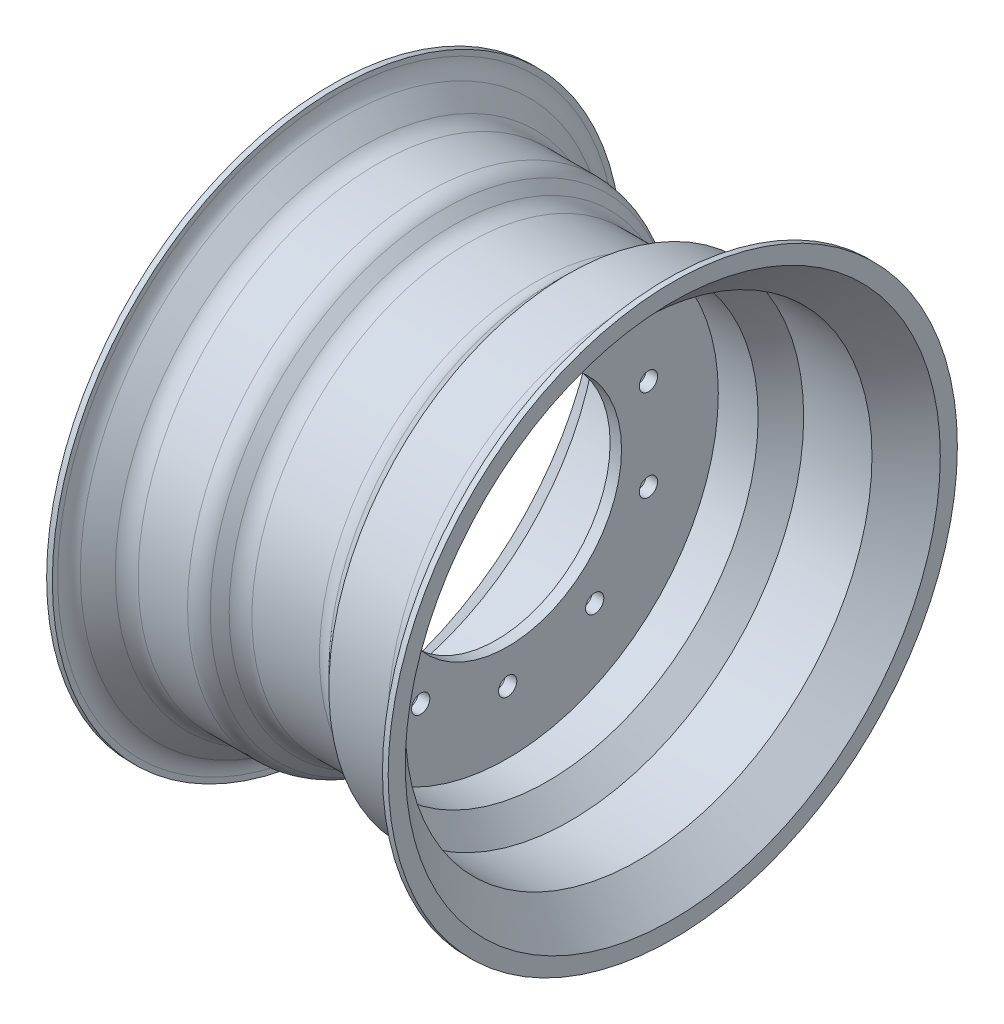
ISO-10303-21;
HEADER;
FILE_DESCRIPTION(('STEP AP214'),'2;1');
FILE_NAME('part.step','',(''),(''),'','','');
FILE_SCHEMA(('AUTOMOTIVE_DESIGN { 1 0 10303 214 1 1 1 1 }'));
ENDSEC;
DATA;
#1=APPLICATION_CONTEXT('core data for automotive mechanical design processes');
#2=APPLICATION_PROTOCOL_DEFINITION('international standard','automotive_design',2000,#1);
#3=PRODUCT_CONTEXT('',#1,'mechanical');
#4=PRODUCT('Part','Part','',(#3));
#5=PRODUCT_RELATED_PRODUCT_CATEGORY('part','',(#4));
#6=PRODUCT_DEFINITION_FORMATION('','',#4);
#7=PRODUCT_DEFINITION_CONTEXT('part definition',#1,'design');
#8=PRODUCT_DEFINITION('design','',#6,#7);
#9=PRODUCT_DEFINITION_SHAPE('','',#8);
#10=(LENGTH_UNIT() NAMED_UNIT(*) SI_UNIT(.MILLI.,.METRE.));
#11=(NAMED_UNIT(*) PLANE_ANGLE_UNIT() SI_UNIT($,.RADIAN.));
#12=(NAMED_UNIT(*) SI_UNIT($,.STERADIAN.) SOLID_ANGLE_UNIT());
#13=UNCERTAINTY_MEASURE_WITH_UNIT(LENGTH_MEASURE(1.E-05),#10,'distance_accuracy_value','');
#14=(GEOMETRIC_REPRESENTATION_CONTEXT(3) GLOBAL_UNCERTAINTY_ASSIGNED_CONTEXT((#13)) GLOBAL_UNIT_ASSIGNED_CONTEXT((#10,
#11,#12)) REPRESENTATION_CONTEXT('',''));
#15=CARTESIAN_POINT('',(0.,0.,0.));
#16=DIRECTION('',(0.,0.,1.));
#17=DIRECTION('',(1.,0.,0.));
#18=AXIS2_PLACEMENT_3D('',#15,#16,#17);
#19=CARTESIAN_POINT('',(0.,0.,0.));
#20=DIRECTION('',(1.,0.,0.));
#21=DIRECTION('',(0.,0.,-1.));
#22=AXIS2_PLACEMENT_3D('',#19,#20,#21);
#23=CYLINDRICAL_SURFACE('',#22,250.);
#24=CARTESIAN_POINT('',(-150.,0.,0.));
#25=DIRECTION('',(1.,0.,0.));
#26=DIRECTION('',(0.,0.,-1.));
#27=AXIS2_PLACEMENT_3D('',#24,#25,#26);
#28=CIRCLE('',#27,250.);
#29=CARTESIAN_POINT('',(-150.,0.,-250.));
#30=VERTEX_POINT('',#29);
#31=EDGE_CURVE('E60',#30,#30,#28,.T.);
#32=ORIENTED_EDGE('',*,*,#31,.T.);
#33=EDGE_LOOP('',(#32));
#34=FACE_BOUND('',#33,.T.);
#35=CARTESIAN_POINT('',(-145.,0.,0.));
#36=DIRECTION('',(1.,0.,0.));
#37=DIRECTION('',(0.,0.,-1.));
#38=AXIS2_PLACEMENT_3D('',#35,#36,#37);
#39=CIRCLE('',#38,250.);
#40=CARTESIAN_POINT('',(-145.,0.,-250.));
#41=VERTEX_POINT('',#40);
#42=EDGE_CURVE('E170',#41,#41,#39,.T.);
#43=ORIENTED_EDGE('',*,*,#42,.F.);
#44=EDGE_LOOP('',(#43));
#45=FACE_BOUND('',#44,.T.);
#46=ADVANCED_FACE('F37',(#34,#45),#23,.T.);
#47=CARTESIAN_POINT('',(-145.,250.,0.));
#48=DIRECTION('',(1.,0.,0.));
#49=DIRECTION('',(0.,0.,-1.));
#50=AXIS2_PLACEMENT_3D('',#47,#48,#49);
#51=PLANE('',#50);
#52=CARTESIAN_POINT('',(-145.,0.,0.));
#53=DIRECTION('',(1.,0.,0.));
#54=DIRECTION('',(0.,0.,-1.));
#55=AXIS2_PLACEMENT_3D('',#52,#53,#54);
#56=CIRCLE('',#55,245.355339059327);
#57=CARTESIAN_POINT('',(-145.,0.,-245.355339059327));
#58=VERTEX_POINT('',#57);
#59=EDGE_CURVE('E10',#58,#58,#56,.F.);
#60=ORIENTED_EDGE('',*,*,#59,.T.);
#61=EDGE_LOOP('',(#60));
#62=FACE_BOUND('',#61,.T.);
#63=ORIENTED_EDGE('',*,*,#42,.T.);
#64=EDGE_LOOP('',(#63));
#65=FACE_BOUND('',#64,.T.);
#66=ADVANCED_FACE('F237',(#62,#65),#51,.T.);
#67=CARTESIAN_POINT('',(-117.928932188135,0.,0.));
#68=DIRECTION('',(-1.,0.,0.));
#69=DIRECTION('',(0.,0.,1.));
#70=AXIS2_PLACEMENT_3D('',#67,#68,#69);
#71=CONICAL_SURFACE('',#70,210.,0.785398163397448);
#72=CARTESIAN_POINT('',(-123.786796564404,0.,0.));
#73=DIRECTION('',(-1.,0.,0.));
#74=DIRECTION('',(0.,0.,1.));
#75=AXIS2_PLACEMENT_3D('',#72,#73,#74);
#76=CIRCLE('',#75,215.857864376269);
#77=CARTESIAN_POINT('',(-123.786796564404,0.,215.857864376269));
#78=VERTEX_POINT('',#77);
#79=EDGE_CURVE('E46',#78,#78,#76,.T.);
#80=ORIENTED_EDGE('',*,*,#79,.T.);
#81=EDGE_LOOP('',(#80));
#82=FACE_BOUND('',#81,.T.);
#83=CARTESIAN_POINT('',(-139.142135623731,0.,0.));
#84=DIRECTION('',(-1.,0.,0.));
#85=DIRECTION('',(0.,0.,1.));
#86=AXIS2_PLACEMENT_3D('',#83,#84,#85);
#87=CIRCLE('',#86,231.213203435596);
#88=CARTESIAN_POINT('',(-139.142135623731,0.,231.213203435596));
#89=VERTEX_POINT('',#88);
#90=EDGE_CURVE('E52',#89,#89,#87,.F.);
#91=ORIENTED_EDGE('',*,*,#90,.T.);
#92=EDGE_LOOP('',(#91));
#93=FACE_BOUND('',#92,.T.);
#94=ADVANCED_FACE('F221',(#82,#93),#71,.T.);
#95=CARTESIAN_POINT('',(0.,0.,0.));
#96=DIRECTION('',(1.,0.,0.));
#97=DIRECTION('',(0.,0.,-1.));
#98=AXIS2_PLACEMENT_3D('',#95,#96,#97);
#99=CYLINDRICAL_SURFACE('',#98,210.);
#100=CARTESIAN_POINT('',(-66.2132034355965,0.,0.));
#101=DIRECTION('',(-1.,0.,0.));
#102=DIRECTION('',(0.,0.,1.));
#103=AXIS2_PLACEMENT_3D('',#100,#101,#102);
#104=CIRCLE('',#103,210.);
#105=CARTESIAN_POINT('',(-66.2132034355965,0.,210.));
#106=VERTEX_POINT('',#105);
#107=EDGE_CURVE('E214',#106,#106,#104,.T.);
#108=ORIENTED_EDGE('',*,*,#107,.T.);
#109=EDGE_LOOP('',(#108));
#110=FACE_BOUND('',#109,.T.);
#111=CARTESIAN_POINT('',(-109.644660940673,0.,0.));
#112=DIRECTION('',(1.,0.,0.));
#113=DIRECTION('',(0.,0.,-1.));
#114=AXIS2_PLACEMENT_3D('',#111,#112,#113);
#115=CIRCLE('',#114,210.);
#116=CARTESIAN_POINT('',(-109.644660940673,0.,-210.));
#117=VERTEX_POINT('',#116);
#118=EDGE_CURVE('E210',#117,#117,#115,.T.);
#119=ORIENTED_EDGE('',*,*,#118,.T.);
#120=EDGE_LOOP('',(#119));
#121=FACE_BOUND('',#120,.T.);
#122=ADVANCED_FACE('F275',(#110,#121),#99,.T.);
#123=CARTESIAN_POINT('',(-37.9289321881344,0.,0.));
#124=DIRECTION('',(-1.,0.,0.));
#125=DIRECTION('',(0.,0.,1.));
#126=AXIS2_PLACEMENT_3D('',#123,#124,#125);
#127=CONICAL_SURFACE('',#126,190.,0.785398163397448);
#128=CARTESIAN_POINT('',(-43.7867965644035,0.,0.));
#129=DIRECTION('',(-1.,0.,0.));
#130=DIRECTION('',(0.,0.,1.));
#131=AXIS2_PLACEMENT_3D('',#128,#129,#130);
#132=CIRCLE('',#131,195.857864376269);
#133=CARTESIAN_POINT('',(-43.7867965644035,0.,195.857864376269));
#134=VERTEX_POINT('',#133);
#135=EDGE_CURVE('E206',#134,#134,#132,.T.);
#136=ORIENTED_EDGE('',*,*,#135,.T.);
#137=EDGE_LOOP('',(#136));
#138=FACE_BOUND('',#137,.T.);
#139=CARTESIAN_POINT('',(-52.0710678118655,0.,0.));
#140=DIRECTION('',(1.,0.,0.));
#141=DIRECTION('',(0.,0.,-1.));
#142=AXIS2_PLACEMENT_3D('',#139,#140,#141);
#143=CIRCLE('',#142,204.142135623731);
#144=CARTESIAN_POINT('',(-52.0710678118655,0.,-204.142135623731));
#145=VERTEX_POINT('',#144);
#146=EDGE_CURVE('E202',#145,#145,#143,.T.);
#147=ORIENTED_EDGE('',*,*,#146,.T.);
#148=EDGE_LOOP('',(#147));
#149=FACE_BOUND('',#148,.T.);
#150=ADVANCED_FACE('F272',(#138,#149),#127,.T.);
#151=CARTESIAN_POINT('',(0.,0.,0.));
#152=DIRECTION('',(1.,0.,0.));
#153=DIRECTION('',(0.,0.,-1.));
#154=AXIS2_PLACEMENT_3D('',#151,#152,#153);
#155=CYLINDRICAL_SURFACE('',#154,190.);
#156=CARTESIAN_POINT('',(29.6446609406725,0.,0.));
#157=DIRECTION('',(1.,0.,0.));
#158=DIRECTION('',(0.,0.,-1.));
#159=AXIS2_PLACEMENT_3D('',#156,#157,#158);
#160=CIRCLE('',#159,190.);
#161=CARTESIAN_POINT('',(29.6446609406725,0.,-190.));
#162=VERTEX_POINT('',#161);
#163=EDGE_CURVE('E182',#162,#162,#160,.F.);
#164=ORIENTED_EDGE('',*,*,#163,.T.);
#165=EDGE_LOOP('',(#164));
#166=FACE_BOUND('',#165,.T.);
#167=CARTESIAN_POINT('',(-29.6446609406725,0.,0.));
#168=DIRECTION('',(1.,0.,0.));
#169=DIRECTION('',(0.,0.,-1.));
#170=AXIS2_PLACEMENT_3D('',#167,#168,#169);
#171=CIRCLE('',#170,190.);
#172=CARTESIAN_POINT('',(-29.6446609406725,0.,-190.));
#173=VERTEX_POINT('',#172);
#174=EDGE_CURVE('E178',#173,#173,#171,.T.);
#175=ORIENTED_EDGE('',*,*,#174,.T.);
#176=EDGE_LOOP('',(#175));
#177=FACE_BOUND('',#176,.T.);
#178=ADVANCED_FACE('F274',(#166,#177),#155,.T.);
#179=CARTESIAN_POINT('',(57.9289321881346,0.,0.));
#180=DIRECTION('',(1.,0.,0.));
#181=DIRECTION('',(0.,0.,-1.));
#182=AXIS2_PLACEMENT_3D('',#179,#180,#181);
#183=CONICAL_SURFACE('',#182,210.,0.785398163397448);
#184=CARTESIAN_POINT('',(43.7867965644035,0.,0.));
#185=DIRECTION('',(1.,0.,0.));
#186=DIRECTION('',(0.,0.,-1.));
#187=AXIS2_PLACEMENT_3D('',#184,#185,#186);
#188=CIRCLE('',#187,195.857864376269);
#189=CARTESIAN_POINT('',(43.7867965644035,0.,-195.857864376269));
#190=VERTEX_POINT('',#189);
#191=EDGE_CURVE('E174',#190,#190,#188,.T.);
#192=ORIENTED_EDGE('',*,*,#191,.T.);
#193=EDGE_LOOP('',(#192));
#194=FACE_BOUND('',#193,.T.);
#195=CARTESIAN_POINT('',(57.9289321881346,0.,0.));
#196=DIRECTION('',(1.,0.,0.));
#197=DIRECTION('',(0.,0.,-1.));
#198=AXIS2_PLACEMENT_3D('',#195,#196,#197);
#199=CIRCLE('',#198,210.);
#200=CARTESIAN_POINT('',(57.9289321881346,0.,-210.));
#201=VERTEX_POINT('',#200);
#202=EDGE_CURVE('E166',#201,#201,#199,.T.);
#203=ORIENTED_EDGE('',*,*,#202,.F.);
#204=EDGE_LOOP('',(#203));
#205=FACE_BOUND('',#204,.T.);
#206=ADVANCED_FACE('F282',(#194,#205),#183,.T.);
#207=CARTESIAN_POINT('',(0.,0.,0.));
#208=DIRECTION('',(1.,0.,0.));
#209=DIRECTION('',(0.,0.,-1.));
#210=AXIS2_PLACEMENT_3D('',#207,#208,#209);
#211=CYLINDRICAL_SURFACE('',#210,210.);
#212=CARTESIAN_POINT('',(109.644660940673,0.,0.));
#213=DIRECTION('',(1.,0.,0.));
#214=DIRECTION('',(0.,0.,-1.));
#215=AXIS2_PLACEMENT_3D('',#212,#213,#214);
#216=CIRCLE('',#215,210.);
#217=CARTESIAN_POINT('',(109.644660940673,0.,-210.));
#218=VERTEX_POINT('',#217);
#219=EDGE_CURVE('E198',#218,#218,#216,.F.);
#220=ORIENTED_EDGE('',*,*,#219,.T.);
#221=EDGE_LOOP('',(#220));
#222=FACE_BOUND('',#221,.T.);
#223=ORIENTED_EDGE('',*,*,#202,.T.);
#224=EDGE_LOOP('',(#223));
#225=FACE_BOUND('',#224,.T.);
#226=ADVANCED_FACE('F321',(#222,#225),#211,.T.);
#227=CARTESIAN_POINT('',(145.,0.,0.));
#228=DIRECTION('',(1.,0.,0.));
#229=DIRECTION('',(0.,0.,-1.));
#230=AXIS2_PLACEMENT_3D('',#227,#228,#229);
#231=CONICAL_SURFACE('',#230,237.071067811865,0.785398163397448);
#232=CARTESIAN_POINT('',(139.142135623731,0.,0.));
#233=DIRECTION('',(1.,0.,0.));
#234=DIRECTION('',(0.,0.,-1.));
#235=AXIS2_PLACEMENT_3D('',#232,#233,#234);
#236=CIRCLE('',#235,231.213203435596);
#237=CARTESIAN_POINT('',(139.142135623731,0.,-231.213203435596));
#238=VERTEX_POINT('',#237);
#239=EDGE_CURVE('E194',#238,#238,#236,.F.);
#240=ORIENTED_EDGE('',*,*,#239,.T.);
#241=EDGE_LOOP('',(#240));
#242=FACE_BOUND('',#241,.T.);
#243=CARTESIAN_POINT('',(123.786796564404,0.,0.));
#244=DIRECTION('',(1.,0.,0.));
#245=DIRECTION('',(0.,0.,-1.));
#246=AXIS2_PLACEMENT_3D('',#243,#244,#245);
#247=CIRCLE('',#246,215.857864376269);
#248=CARTESIAN_POINT('',(123.786796564404,0.,-215.857864376269));
#249=VERTEX_POINT('',#248);
#250=EDGE_CURVE('E190',#249,#249,#247,.T.);
#251=ORIENTED_EDGE('',*,*,#250,.T.);
#252=EDGE_LOOP('',(#251));
#253=FACE_BOUND('',#252,.T.);
#254=ADVANCED_FACE('F330',(#242,#253),#231,.T.);
#255=CARTESIAN_POINT('',(145.,250.,0.));
#256=DIRECTION('',(-1.,0.,0.));
#257=DIRECTION('',(0.,0.,1.));
#258=AXIS2_PLACEMENT_3D('',#255,#256,#257);
#259=PLANE('',#258);
#260=CARTESIAN_POINT('',(145.,0.,0.));
#261=DIRECTION('',(-1.,0.,0.));
#262=DIRECTION('',(0.,0.,1.));
#263=AXIS2_PLACEMENT_3D('',#260,#261,#262);
#264=CIRCLE('',#263,245.355339059327);
#265=CARTESIAN_POINT('',(145.,0.,245.355339059327));
#266=VERTEX_POINT('',#265);
#267=EDGE_CURVE('E186',#266,#266,#264,.F.);
#268=ORIENTED_EDGE('',*,*,#267,.T.);
#269=EDGE_LOOP('',(#268));
#270=FACE_BOUND('',#269,.T.);
#271=CARTESIAN_POINT('',(145.,0.,0.));
#272=DIRECTION('',(1.,0.,0.));
#273=DIRECTION('',(0.,0.,-1.));
#274=AXIS2_PLACEMENT_3D('',#271,#272,#273);
#275=CIRCLE('',#274,250.);
#276=CARTESIAN_POINT('',(145.,0.,-250.));
#277=VERTEX_POINT('',#276);
#278=EDGE_CURVE('E162',#277,#277,#275,.T.);
#279=ORIENTED_EDGE('',*,*,#278,.F.);
#280=EDGE_LOOP('',(#279));
#281=FACE_BOUND('',#280,.T.);
#282=ADVANCED_FACE('F340',(#270,#281),#259,.T.);
#283=CARTESIAN_POINT('',(0.,0.,0.));
#284=DIRECTION('',(1.,0.,0.));
#285=DIRECTION('',(0.,0.,-1.));
#286=AXIS2_PLACEMENT_3D('',#283,#284,#285);
#287=CYLINDRICAL_SURFACE('',#286,250.);
#288=ORIENTED_EDGE('',*,*,#278,.T.);
#289=EDGE_LOOP('',(#288));
#290=FACE_BOUND('',#289,.T.);
#291=CARTESIAN_POINT('',(150.,0.,0.));
#292=DIRECTION('',(1.,0.,0.));
#293=DIRECTION('',(0.,0.,-1.));
#294=AXIS2_PLACEMENT_3D('',#291,#292,#293);
#295=CIRCLE('',#294,250.);
#296=CARTESIAN_POINT('',(150.,0.,-250.));
#297=VERTEX_POINT('',#296);
#298=EDGE_CURVE('E158',#297,#297,#295,.T.);
#299=ORIENTED_EDGE('',*,*,#298,.F.);
#300=EDGE_LOOP('',(#299));
#301=FACE_BOUND('',#300,.T.);
#302=ADVANCED_FACE('F350',(#290,#301),#287,.T.);
#303=CARTESIAN_POINT('',(150.,250.,0.));
#304=DIRECTION('',(1.,0.,0.));
#305=DIRECTION('',(0.,0.,-1.));
#306=AXIS2_PLACEMENT_3D('',#303,#304,#305);
#307=PLANE('',#306);
#308=ORIENTED_EDGE('',*,*,#298,.T.);
#309=EDGE_LOOP('',(#308));
#310=FACE_BOUND('',#309,.T.);
#311=CARTESIAN_POINT('',(150.,0.,0.));
#312=DIRECTION('',(1.,0.,0.));
#313=DIRECTION('',(0.,0.,-1.));
#314=AXIS2_PLACEMENT_3D('',#311,#312,#313);
#315=CIRCLE('',#314,235.);
#316=CARTESIAN_POINT('',(150.,0.,-235.));
#317=VERTEX_POINT('',#316);
#318=EDGE_CURVE('E154',#317,#317,#315,.T.);
#319=ORIENTED_EDGE('',*,*,#318,.F.);
#320=EDGE_LOOP('',(#319));
#321=FACE_BOUND('',#320,.T.);
#322=ADVANCED_FACE('F552',(#310,#321),#307,.T.);
#323=CARTESIAN_POINT('',(120.,0.,0.));
#324=DIRECTION('',(1.,0.,0.));
#325=DIRECTION('',(0.,0.,-1.));
#326=AXIS2_PLACEMENT_3D('',#323,#324,#325);
#327=CONICAL_SURFACE('',#326,205.,0.785398163397447);
#328=ORIENTED_EDGE('',*,*,#318,.T.);
#329=EDGE_LOOP('',(#328));
#330=FACE_BOUND('',#329,.T.);
#331=CARTESIAN_POINT('',(120.,0.,0.));
#332=DIRECTION('',(1.,0.,0.));
#333=DIRECTION('',(0.,0.,-1.));
#334=AXIS2_PLACEMENT_3D('',#331,#332,#333);
#335=CIRCLE('',#334,205.);
#336=CARTESIAN_POINT('',(120.,0.,-205.));
#337=VERTEX_POINT('',#336);
#338=EDGE_CURVE('E150',#337,#337,#335,.T.);
#339=ORIENTED_EDGE('',*,*,#338,.F.);
#340=EDGE_LOOP('',(#339));
#341=FACE_BOUND('',#340,.T.);
#342=ADVANCED_FACE('F548',(#330,#341),#327,.F.);
#343=CARTESIAN_POINT('',(0.,0.,0.));
#344=DIRECTION('',(1.,0.,0.));
#345=DIRECTION('',(0.,0.,-1.));
#346=AXIS2_PLACEMENT_3D('',#343,#344,#345);
#347=CYLINDRICAL_SURFACE('',#346,205.);
#348=ORIENTED_EDGE('',*,*,#338,.T.);
#349=EDGE_LOOP('',(#348));
#350=FACE_BOUND('',#349,.T.);
#351=CARTESIAN_POINT('',(60.,0.,0.));
#352=DIRECTION('',(1.,0.,0.));
#353=DIRECTION('',(0.,0.,-1.));
#354=AXIS2_PLACEMENT_3D('',#351,#352,#353);
#355=CIRCLE('',#354,205.);
#356=CARTESIAN_POINT('',(60.,0.,-205.));
#357=VERTEX_POINT('',#356);
#358=EDGE_CURVE('E146',#357,#357,#355,.T.);
#359=ORIENTED_EDGE('',*,*,#358,.F.);
#360=EDGE_LOOP('',(#359));
#361=FACE_BOUND('',#360,.T.);
#362=ADVANCED_FACE('F544',(#350,#361),#347,.F.);
#363=CARTESIAN_POINT('',(40.,0.,0.));
#364=DIRECTION('',(1.,0.,0.));
#365=DIRECTION('',(0.,0.,-1.));
#366=AXIS2_PLACEMENT_3D('',#363,#364,#365);
#367=CONICAL_SURFACE('',#366,185.,0.78539816339745);
#368=ORIENTED_EDGE('',*,*,#358,.T.);
#369=EDGE_LOOP('',(#368));
#370=FACE_BOUND('',#369,.T.);
#371=CARTESIAN_POINT('',(40.,0.,0.));
#372=DIRECTION('',(1.,0.,0.));
#373=DIRECTION('',(0.,0.,-1.));
#374=AXIS2_PLACEMENT_3D('',#371,#372,#373);
#375=CIRCLE('',#374,185.);
#376=CARTESIAN_POINT('',(40.,0.,-185.));
#377=VERTEX_POINT('',#376);
#378=EDGE_CURVE('E142',#377,#377,#375,.T.);
#379=ORIENTED_EDGE('',*,*,#378,.F.);
#380=EDGE_LOOP('',(#379));
#381=FACE_BOUND('',#380,.T.);
#382=ADVANCED_FACE('F540',(#370,#381),#367,.F.);
#383=CARTESIAN_POINT('',(0.,0.,0.));
#384=DIRECTION('',(1.,0.,0.));
#385=DIRECTION('',(0.,0.,-1.));
#386=AXIS2_PLACEMENT_3D('',#383,#384,#385);
#387=CYLINDRICAL_SURFACE('',#386,185.);
#388=ORIENTED_EDGE('',*,*,#378,.T.);
#389=EDGE_LOOP('',(#388));
#390=FACE_BOUND('',#389,.T.);
#391=CARTESIAN_POINT('',(4.99999999999999,0.,0.));
#392=DIRECTION('',(1.,0.,0.));
#393=DIRECTION('',(0.,0.,-1.));
#394=AXIS2_PLACEMENT_3D('',#391,#392,#393);
#395=CIRCLE('',#394,185.);
#396=CARTESIAN_POINT('',(4.99999999999999,0.,-185.));
#397=VERTEX_POINT('',#396);
#398=EDGE_CURVE('E138',#397,#397,#395,.T.);
#399=ORIENTED_EDGE('',*,*,#398,.F.);
#400=EDGE_LOOP('',(#399));
#401=FACE_BOUND('',#400,.T.);
#402=ADVANCED_FACE('F412',(#390,#401),#387,.F.);
#403=CARTESIAN_POINT('',(5.,100.,0.));
#404=DIRECTION('',(1.,0.,0.));
#405=DIRECTION('',(0.,0.,-1.));
#406=AXIS2_PLACEMENT_3D('',#403,#404,#405);
#407=PLANE('',#406);
#408=CARTESIAN_POINT('',(5.,105.172209268744,-76.4120827980201));
#409=DIRECTION('',(1.,0.,0.));
#410=DIRECTION('',(0.,-0.587785252292462,-0.809016994374955));
#411=AXIS2_PLACEMENT_3D('',#408,#409,#410);
#412=CIRCLE('',#411,8.);
#413=CARTESIAN_POINT('',(5.,100.469927250404,-82.8842187530198));
#414=VERTEX_POINT('',#413);
#415=EDGE_CURVE('E669',#414,#414,#412,.T.);
#416=ORIENTED_EDGE('',*,*,#415,.F.);
#417=EDGE_LOOP('',(#416));
#418=FACE_BOUND('',#417,.T.);
#419=CARTESIAN_POINT('',(5.,40.1722092687446,-123.63734711837));
#420=DIRECTION('',(1.,0.,0.));
#421=DIRECTION('',(0.,-0.95105651629515,-0.309016994374958));
#422=AXIS2_PLACEMENT_3D('',#419,#420,#421);
#423=CIRCLE('',#422,8.);
#424=CARTESIAN_POINT('',(5.,32.5637571383834,-126.109483073369));
#425=VERTEX_POINT('',#424);
#426=EDGE_CURVE('E671',#425,#425,#423,.T.);
#427=ORIENTED_EDGE('',*,*,#426,.F.);
#428=EDGE_LOOP('',(#427));
#429=FACE_BOUND('',#428,.T.);
#430=CARTESIAN_POINT('',(5.,-40.172209268742,-123.63734711837));
#431=DIRECTION('',(1.,0.,0.));
#432=DIRECTION('',(0.,-0.951056516295157,0.309016994374938));
#433=AXIS2_PLACEMENT_3D('',#430,#431,#432);
#434=CIRCLE('',#433,8.);
#435=CARTESIAN_POINT('',(5.,-47.7806613991032,-121.165211163371));
#436=VERTEX_POINT('',#435);
#437=EDGE_CURVE('E674',#436,#436,#434,.T.);
#438=ORIENTED_EDGE('',*,*,#437,.F.);
#439=EDGE_LOOP('',(#438));
#440=FACE_BOUND('',#439,.T.);
#441=CARTESIAN_POINT('',(5.,-105.172209268742,-76.4120827980224));
#442=DIRECTION('',(1.,0.,0.));
#443=DIRECTION('',(0.,-0.58778525229248,0.809016994374942));
#444=AXIS2_PLACEMENT_3D('',#441,#442,#443);
#445=CIRCLE('',#444,8.);
#446=CARTESIAN_POINT('',(5.,-109.874491287082,-69.9399468430229));
#447=VERTEX_POINT('',#446);
#448=EDGE_CURVE('E680',#447,#447,#445,.T.);
#449=ORIENTED_EDGE('',*,*,#448,.F.);
#450=EDGE_LOOP('',(#449));
#451=FACE_BOUND('',#450,.T.);
#452=CARTESIAN_POINT('',(5.,-130.,0.));
#453=DIRECTION('',(1.,0.,0.));
#454=DIRECTION('',(0.,0.,1.));
#455=AXIS2_PLACEMENT_3D('',#452,#453,#454);
#456=CIRCLE('',#455,8.);
#457=CARTESIAN_POINT('',(5.,-130.,8.));
#458=VERTEX_POINT('',#457);
#459=EDGE_CURVE('E684',#458,#458,#456,.T.);
#460=ORIENTED_EDGE('',*,*,#459,.F.);
#461=EDGE_LOOP('',(#460));
#462=FACE_BOUND('',#461,.T.);
#463=CARTESIAN_POINT('',(5.,-105.172209268744,76.4120827980209));
#464=DIRECTION('',(1.,0.,0.));
#465=DIRECTION('',(0.,0.587785252292469,0.809016994374951));
#466=AXIS2_PLACEMENT_3D('',#463,#464,#465);
#467=CIRCLE('',#466,8.);
#468=CARTESIAN_POINT('',(5.,-100.469927250404,82.8842187530205));
#469=VERTEX_POINT('',#468);
#470=EDGE_CURVE('E688',#469,#469,#467,.T.);
#471=ORIENTED_EDGE('',*,*,#470,.F.);
#472=EDGE_LOOP('',(#471));
#473=FACE_BOUND('',#472,.T.);
#474=CARTESIAN_POINT('',(5.,-40.1722092687437,123.63734711837));
#475=DIRECTION('',(1.,0.,0.));
#476=DIRECTION('',(0.,0.951056516295152,0.309016994374952));
#477=AXIS2_PLACEMENT_3D('',#474,#475,#476);
#478=CIRCLE('',#477,8.);
#479=CARTESIAN_POINT('',(5.,-32.5637571383825,126.109483073369));
#480=VERTEX_POINT('',#479);
#481=EDGE_CURVE('E692',#480,#480,#478,.T.);
#482=ORIENTED_EDGE('',*,*,#481,.F.);
#483=EDGE_LOOP('',(#482));
#484=FACE_BOUND('',#483,.T.);
#485=CARTESIAN_POINT('',(5.,40.1722092687428,123.63734711837));
#486=DIRECTION('',(1.,0.,0.));
#487=DIRECTION('',(0.,0.951056516295155,-0.309016994374945));
#488=AXIS2_PLACEMENT_3D('',#485,#486,#487);
#489=CIRCLE('',#488,8.);
#490=CARTESIAN_POINT('',(5.,47.7806613991041,121.165211163371));
#491=VERTEX_POINT('',#490);
#492=EDGE_CURVE('E696',#491,#491,#489,.T.);
#493=ORIENTED_EDGE('',*,*,#492,.F.);
#494=EDGE_LOOP('',(#493));
#495=FACE_BOUND('',#494,.T.);
#496=CARTESIAN_POINT('',(5.,105.172209268743,76.4120827980217));
#497=DIRECTION('',(1.,0.,0.));
#498=DIRECTION('',(0.,0.587785252292474,-0.809016994374947));
#499=AXIS2_PLACEMENT_3D('',#496,#497,#498);
#500=CIRCLE('',#499,8.);
#501=CARTESIAN_POINT('',(5.,109.874491287083,69.9399468430221));
#502=VERTEX_POINT('',#501);
#503=EDGE_CURVE('E67',#502,#502,#500,.T.);
#504=ORIENTED_EDGE('',*,*,#503,.F.);
#505=EDGE_LOOP('',(#504));
#506=FACE_BOUND('',#505,.T.);
#507=CARTESIAN_POINT('',(5.,130.,0.));
#508=DIRECTION('',(1.,0.,0.));
#509=DIRECTION('',(0.,0.,-1.));
#510=AXIS2_PLACEMENT_3D('',#507,#508,#509);
#511=CIRCLE('',#510,8.);
#512=CARTESIAN_POINT('',(5.,130.,-8.));
#513=VERTEX_POINT('',#512);
#514=EDGE_CURVE('E61',#513,#513,#511,.T.);
#515=ORIENTED_EDGE('',*,*,#514,.F.);
#516=EDGE_LOOP('',(#515));
#517=FACE_BOUND('',#516,.T.);
#518=ORIENTED_EDGE('',*,*,#398,.T.);
#519=EDGE_LOOP('',(#518));
#520=FACE_BOUND('',#519,.T.);
#521=CARTESIAN_POINT('',(5.00000000000001,0.,0.));
#522=DIRECTION('',(1.,0.,0.));
#523=DIRECTION('',(0.,0.,-1.));
#524=AXIS2_PLACEMENT_3D('',#521,#522,#523);
#525=CIRCLE('',#524,100.);
#526=CARTESIAN_POINT('',(5.00000000000001,0.,-100.));
#527=VERTEX_POINT('',#526);
#528=EDGE_CURVE('E134',#527,#527,#525,.T.);
#529=ORIENTED_EDGE('',*,*,#528,.F.);
#530=EDGE_LOOP('',(#529));
#531=FACE_BOUND('',#530,.T.);
#532=ADVANCED_FACE('F406',(#418,#429,#440,#451,#462,#473,#484,#495,#506,#517,#520,#531),#407,.T.);
#533=CARTESIAN_POINT('',(0.,0.,0.));
#534=DIRECTION('',(1.,0.,0.));
#535=DIRECTION('',(0.,0.,-1.));
#536=AXIS2_PLACEMENT_3D('',#533,#534,#535);
#537=CYLINDRICAL_SURFACE('',#536,100.);
#538=ORIENTED_EDGE('',*,*,#528,.T.);
#539=EDGE_LOOP('',(#538));
#540=FACE_BOUND('',#539,.T.);
#541=CARTESIAN_POINT('',(-4.99999999999999,0.,0.));
#542=DIRECTION('',(1.,0.,0.));
#543=DIRECTION('',(0.,0.,-1.));
#544=AXIS2_PLACEMENT_3D('',#541,#542,#543);
#545=CIRCLE('',#544,100.);
#546=CARTESIAN_POINT('',(-4.99999999999999,0.,-100.));
#547=VERTEX_POINT('',#546);
#548=EDGE_CURVE('E130',#547,#547,#545,.T.);
#549=ORIENTED_EDGE('',*,*,#548,.F.);
#550=EDGE_LOOP('',(#549));
#551=FACE_BOUND('',#550,.T.);
#552=ADVANCED_FACE('F411',(#540,#551),#537,.F.);
#553=CARTESIAN_POINT('',(-5.,100.,0.));
#554=DIRECTION('',(-1.,0.,0.));
#555=DIRECTION('',(0.,0.,1.));
#556=AXIS2_PLACEMENT_3D('',#553,#554,#555);
#557=PLANE('',#556);
#558=CARTESIAN_POINT('',(-5.,105.172209268744,-76.4120827980201));
#559=DIRECTION('',(-1.,0.,0.));
#560=DIRECTION('',(0.,0.,1.));
#561=AXIS2_PLACEMENT_3D('',#558,#559,#560);
#562=CIRCLE('',#561,8.);
#563=CARTESIAN_POINT('',(-5.,105.172209268744,-68.4120827980201));
#564=VERTEX_POINT('',#563);
#565=EDGE_CURVE('E41',#564,#564,#562,.T.);
#566=ORIENTED_EDGE('',*,*,#565,.F.);
#567=EDGE_LOOP('',(#566));
#568=FACE_BOUND('',#567,.T.);
#569=CARTESIAN_POINT('',(-5.,40.1722092687446,-123.63734711837));
#570=DIRECTION('',(-1.,0.,0.));
#571=DIRECTION('',(0.,0.,1.));
#572=AXIS2_PLACEMENT_3D('',#569,#570,#571);
#573=CIRCLE('',#572,8.);
#574=CARTESIAN_POINT('',(-5.,40.1722092687446,-115.63734711837));
#575=VERTEX_POINT('',#574);
#576=EDGE_CURVE('E90',#575,#575,#573,.T.);
#577=ORIENTED_EDGE('',*,*,#576,.F.);
#578=EDGE_LOOP('',(#577));
#579=FACE_BOUND('',#578,.T.);
#580=CARTESIAN_POINT('',(-5.,-40.172209268742,-123.63734711837));
#581=DIRECTION('',(-1.,0.,0.));
#582=DIRECTION('',(0.,0.,1.));
#583=AXIS2_PLACEMENT_3D('',#580,#581,#582);
#584=CIRCLE('',#583,8.);
#585=CARTESIAN_POINT('',(-5.,-40.172209268742,-115.63734711837));
#586=VERTEX_POINT('',#585);
#587=EDGE_CURVE('E87',#586,#586,#584,.T.);
#588=ORIENTED_EDGE('',*,*,#587,.F.);
#589=EDGE_LOOP('',(#588));
#590=FACE_BOUND('',#589,.T.);
#591=CARTESIAN_POINT('',(-5.,-105.172209268742,-76.4120827980224));
#592=DIRECTION('',(-1.,0.,0.));
#593=DIRECTION('',(0.,0.,1.));
#594=AXIS2_PLACEMENT_3D('',#591,#592,#593);
#595=CIRCLE('',#594,8.);
#596=CARTESIAN_POINT('',(-5.,-105.172209268742,-68.4120827980224));
#597=VERTEX_POINT('',#596);
#598=EDGE_CURVE('E83',#597,#597,#595,.T.);
#599=ORIENTED_EDGE('',*,*,#598,.F.);
#600=EDGE_LOOP('',(#599));
#601=FACE_BOUND('',#600,.T.);
#602=CARTESIAN_POINT('',(-5.,-130.,0.));
#603=DIRECTION('',(-1.,0.,0.));
#604=DIRECTION('',(0.,0.,1.));
#605=AXIS2_PLACEMENT_3D('',#602,#603,#604);
#606=CIRCLE('',#605,8.);
#607=CARTESIAN_POINT('',(-5.,-130.,8.));
#608=VERTEX_POINT('',#607);
#609=EDGE_CURVE('E79',#608,#608,#606,.T.);
#610=ORIENTED_EDGE('',*,*,#609,.F.);
#611=EDGE_LOOP('',(#610));
#612=FACE_BOUND('',#611,.T.);
#613=CARTESIAN_POINT('',(-5.,-105.172209268744,76.4120827980209));
#614=DIRECTION('',(-1.,0.,0.));
#615=DIRECTION('',(0.,0.,1.));
#616=AXIS2_PLACEMENT_3D('',#613,#614,#615);
#617=CIRCLE('',#616,8.);
#618=CARTESIAN_POINT('',(-5.,-105.172209268744,84.4120827980209));
#619=VERTEX_POINT('',#618);
#620=EDGE_CURVE('E75',#619,#619,#617,.T.);
#621=ORIENTED_EDGE('',*,*,#620,.F.);
#622=EDGE_LOOP('',(#621));
#623=FACE_BOUND('',#622,.T.);
#624=CARTESIAN_POINT('',(-5.,-40.1722092687437,123.63734711837));
#625=DIRECTION('',(-1.,0.,0.));
#626=DIRECTION('',(0.,0.,1.));
#627=AXIS2_PLACEMENT_3D('',#624,#625,#626);
#628=CIRCLE('',#627,8.);
#629=CARTESIAN_POINT('',(-5.,-40.1722092687437,131.63734711837));
#630=VERTEX_POINT('',#629);
#631=EDGE_CURVE('E71',#630,#630,#628,.T.);
#632=ORIENTED_EDGE('',*,*,#631,.F.);
#633=EDGE_LOOP('',(#632));
#634=FACE_BOUND('',#633,.T.);
#635=CARTESIAN_POINT('',(-5.,40.1722092687428,123.63734711837));
#636=DIRECTION('',(-1.,0.,0.));
#637=DIRECTION('',(0.,0.,1.));
#638=AXIS2_PLACEMENT_3D('',#635,#636,#637);
#639=CIRCLE('',#638,8.);
#640=CARTESIAN_POINT('',(-5.,40.1722092687428,131.63734711837));
#641=VERTEX_POINT('',#640);
#642=EDGE_CURVE('E66',#641,#641,#639,.T.);
#643=ORIENTED_EDGE('',*,*,#642,.F.);
#644=EDGE_LOOP('',(#643));
#645=FACE_BOUND('',#644,.T.);
#646=CARTESIAN_POINT('',(-5.,105.172209268743,76.4120827980217));
#647=DIRECTION('',(-1.,0.,0.));
#648=DIRECTION('',(0.,0.,1.));
#649=AXIS2_PLACEMENT_3D('',#646,#647,#648);
#650=CIRCLE('',#649,8.);
#651=CARTESIAN_POINT('',(-5.,105.172209268743,84.4120827980217));
#652=VERTEX_POINT('',#651);
#653=EDGE_CURVE('E62',#652,#652,#650,.T.);
#654=ORIENTED_EDGE('',*,*,#653,.F.);
#655=EDGE_LOOP('',(#654));
#656=FACE_BOUND('',#655,.T.);
#657=CARTESIAN_POINT('',(-5.,130.,0.));
#658=DIRECTION('',(-1.,0.,0.));
#659=DIRECTION('',(0.,0.,1.));
#660=AXIS2_PLACEMENT_3D('',#657,#658,#659);
#661=CIRCLE('',#660,8.);
#662=CARTESIAN_POINT('',(-5.,130.,8.));
#663=VERTEX_POINT('',#662);
#664=EDGE_CURVE('E56',#663,#663,#661,.T.);
#665=ORIENTED_EDGE('',*,*,#664,.F.);
#666=EDGE_LOOP('',(#665));
#667=FACE_BOUND('',#666,.T.);
#668=ORIENTED_EDGE('',*,*,#548,.T.);
#669=EDGE_LOOP('',(#668));
#670=FACE_BOUND('',#669,.T.);
#671=CARTESIAN_POINT('',(-5.00000000000001,0.,0.));
#672=DIRECTION('',(1.,0.,0.));
#673=DIRECTION('',(0.,0.,-1.));
#674=AXIS2_PLACEMENT_3D('',#671,#672,#673);
#675=CIRCLE('',#674,185.);
#676=CARTESIAN_POINT('',(-5.00000000000001,0.,-185.));
#677=VERTEX_POINT('',#676);
#678=EDGE_CURVE('E126',#677,#677,#675,.T.);
#679=ORIENTED_EDGE('',*,*,#678,.F.);
#680=EDGE_LOOP('',(#679));
#681=FACE_BOUND('',#680,.T.);
#682=ADVANCED_FACE('F422',(#568,#579,#590,#601,#612,#623,#634,#645,#656,#667,#670,#681),#557,.T.);
#683=CARTESIAN_POINT('',(0.,0.,0.));
#684=DIRECTION('',(1.,0.,0.));
#685=DIRECTION('',(0.,0.,-1.));
#686=AXIS2_PLACEMENT_3D('',#683,#684,#685);
#687=CYLINDRICAL_SURFACE('',#686,185.);
#688=ORIENTED_EDGE('',*,*,#678,.T.);
#689=EDGE_LOOP('',(#688));
#690=FACE_BOUND('',#689,.T.);
#691=CARTESIAN_POINT('',(-40.,0.,0.));
#692=DIRECTION('',(1.,0.,0.));
#693=DIRECTION('',(0.,0.,-1.));
#694=AXIS2_PLACEMENT_3D('',#691,#692,#693);
#695=CIRCLE('',#694,185.);
#696=CARTESIAN_POINT('',(-40.,0.,-185.));
#697=VERTEX_POINT('',#696);
#698=EDGE_CURVE('E122',#697,#697,#695,.T.);
#699=ORIENTED_EDGE('',*,*,#698,.F.);
#700=EDGE_LOOP('',(#699));
#701=FACE_BOUND('',#700,.T.);
#702=ADVANCED_FACE('F427',(#690,#701),#687,.F.);
#703=CARTESIAN_POINT('',(-60.,0.,0.));
#704=DIRECTION('',(-1.,0.,0.));
#705=DIRECTION('',(0.,0.,1.));
#706=AXIS2_PLACEMENT_3D('',#703,#704,#705);
#707=CONICAL_SURFACE('',#706,205.,0.78539816339745);
#708=ORIENTED_EDGE('',*,*,#698,.T.);
#709=EDGE_LOOP('',(#708));
#710=FACE_BOUND('',#709,.T.);
#711=CARTESIAN_POINT('',(-60.,0.,0.));
#712=DIRECTION('',(1.,0.,0.));
#713=DIRECTION('',(0.,0.,-1.));
#714=AXIS2_PLACEMENT_3D('',#711,#712,#713);
#715=CIRCLE('',#714,205.);
#716=CARTESIAN_POINT('',(-60.,0.,-205.));
#717=VERTEX_POINT('',#716);
#718=EDGE_CURVE('E118',#717,#717,#715,.T.);
#719=ORIENTED_EDGE('',*,*,#718,.F.);
#720=EDGE_LOOP('',(#719));
#721=FACE_BOUND('',#720,.T.);
#722=ADVANCED_FACE('F530',(#710,#721),#707,.F.);
#723=CARTESIAN_POINT('',(0.,0.,0.));
#724=DIRECTION('',(1.,0.,0.));
#725=DIRECTION('',(0.,0.,-1.));
#726=AXIS2_PLACEMENT_3D('',#723,#724,#725);
#727=CYLINDRICAL_SURFACE('',#726,205.);
#728=ORIENTED_EDGE('',*,*,#718,.T.);
#729=EDGE_LOOP('',(#728));
#730=FACE_BOUND('',#729,.T.);
#731=CARTESIAN_POINT('',(-120.,0.,0.));
#732=DIRECTION('',(1.,0.,0.));
#733=DIRECTION('',(0.,0.,-1.));
#734=AXIS2_PLACEMENT_3D('',#731,#732,#733);
#735=CIRCLE('',#734,205.);
#736=CARTESIAN_POINT('',(-120.,0.,-205.));
#737=VERTEX_POINT('',#736);
#738=EDGE_CURVE('E114',#737,#737,#735,.T.);
#739=ORIENTED_EDGE('',*,*,#738,.F.);
#740=EDGE_LOOP('',(#739));
#741=FACE_BOUND('',#740,.T.);
#742=ADVANCED_FACE('F526',(#730,#741),#727,.F.);
#743=CARTESIAN_POINT('',(-150.,0.,0.));
#744=DIRECTION('',(-1.,0.,0.));
#745=DIRECTION('',(0.,0.,1.));
#746=AXIS2_PLACEMENT_3D('',#743,#744,#745);
#747=CONICAL_SURFACE('',#746,235.,0.785398163397447);
#748=ORIENTED_EDGE('',*,*,#738,.T.);
#749=EDGE_LOOP('',(#748));
#750=FACE_BOUND('',#749,.T.);
#751=CARTESIAN_POINT('',(-150.,0.,0.));
#752=DIRECTION('',(1.,0.,0.));
#753=DIRECTION('',(0.,0.,-1.));
#754=AXIS2_PLACEMENT_3D('',#751,#752,#753);
#755=CIRCLE('',#754,235.);
#756=CARTESIAN_POINT('',(-150.,0.,-235.));
#757=VERTEX_POINT('',#756);
#758=EDGE_CURVE('E110',#757,#757,#755,.T.);
#759=ORIENTED_EDGE('',*,*,#758,.F.);
#760=EDGE_LOOP('',(#759));
#761=FACE_BOUND('',#760,.T.);
#762=ADVANCED_FACE('F522',(#750,#761),#747,.F.);
#763=CARTESIAN_POINT('',(-150.,250.,0.));
#764=DIRECTION('',(-1.,0.,0.));
#765=DIRECTION('',(0.,0.,1.));
#766=AXIS2_PLACEMENT_3D('',#763,#764,#765);
#767=PLANE('',#766);
#768=ORIENTED_EDGE('',*,*,#758,.T.);
#769=EDGE_LOOP('',(#768));
#770=FACE_BOUND('',#769,.T.);
#771=ORIENTED_EDGE('',*,*,#31,.F.);
#772=EDGE_LOOP('',(#771));
#773=FACE_BOUND('',#772,.T.);
#774=ADVANCED_FACE('F251',(#770,#773),#767,.T.);
#775=CARTESIAN_POINT('',(29.6446609406725,0.,0.));
#776=DIRECTION('',(1.,0.,0.));
#777=DIRECTION('',(0.,0.,-1.));
#778=AXIS2_PLACEMENT_3D('',#775,#776,#777);
#779=TOROIDAL_SURFACE('',#778,210.,20.);
#780=ORIENTED_EDGE('',*,*,#163,.F.);
#781=EDGE_LOOP('',(#780));
#782=FACE_BOUND('',#781,.T.);
#783=ORIENTED_EDGE('',*,*,#191,.F.);
#784=EDGE_LOOP('',(#783));
#785=FACE_BOUND('',#784,.T.);
#786=ADVANCED_FACE('F247',(#782,#785),#779,.F.);
#787=CARTESIAN_POINT('',(125.,0.,0.));
#788=DIRECTION('',(-1.,0.,0.));
#789=DIRECTION('',(0.,0.,1.));
#790=AXIS2_PLACEMENT_3D('',#787,#788,#789);
#791=TOROIDAL_SURFACE('',#790,245.355339059327,20.);
#792=ORIENTED_EDGE('',*,*,#239,.F.);
#793=EDGE_LOOP('',(#792));
#794=FACE_BOUND('',#793,.T.);
#795=ORIENTED_EDGE('',*,*,#267,.F.);
#796=EDGE_LOOP('',(#795));
#797=FACE_BOUND('',#796,.T.);
#798=ADVANCED_FACE('F250',(#794,#797),#791,.F.);
#799=CARTESIAN_POINT('',(109.644660940673,0.,0.));
#800=DIRECTION('',(1.,0.,0.));
#801=DIRECTION('',(0.,0.,-1.));
#802=AXIS2_PLACEMENT_3D('',#799,#800,#801);
#803=TOROIDAL_SURFACE('',#802,230.,20.);
#804=ORIENTED_EDGE('',*,*,#219,.F.);
#805=EDGE_LOOP('',(#804));
#806=FACE_BOUND('',#805,.T.);
#807=ORIENTED_EDGE('',*,*,#250,.F.);
#808=EDGE_LOOP('',(#807));
#809=FACE_BOUND('',#808,.T.);
#810=ADVANCED_FACE('F255',(#806,#809),#803,.F.);
#811=CARTESIAN_POINT('',(-29.6446609406725,0.,0.));
#812=DIRECTION('',(1.,0.,0.));
#813=DIRECTION('',(0.,0.,-1.));
#814=AXIS2_PLACEMENT_3D('',#811,#812,#813);
#815=TOROIDAL_SURFACE('',#814,210.,20.);
#816=ORIENTED_EDGE('',*,*,#135,.F.);
#817=EDGE_LOOP('',(#816));
#818=FACE_BOUND('',#817,.T.);
#819=ORIENTED_EDGE('',*,*,#174,.F.);
#820=EDGE_LOOP('',(#819));
#821=FACE_BOUND('',#820,.T.);
#822=ADVANCED_FACE('F259',(#818,#821),#815,.F.);
#823=CARTESIAN_POINT('',(-66.2132034355965,0.,0.));
#824=DIRECTION('',(-1.,0.,0.));
#825=DIRECTION('',(0.,0.,1.));
#826=AXIS2_PLACEMENT_3D('',#823,#824,#825);
#827=TOROIDAL_SURFACE('',#826,190.,20.);
#828=ORIENTED_EDGE('',*,*,#107,.F.);
#829=EDGE_LOOP('',(#828));
#830=FACE_BOUND('',#829,.T.);
#831=ORIENTED_EDGE('',*,*,#146,.F.);
#832=EDGE_LOOP('',(#831));
#833=FACE_BOUND('',#832,.T.);
#834=ADVANCED_FACE('F234',(#830,#833),#827,.T.);
#835=CARTESIAN_POINT('',(-109.644660940673,0.,0.));
#836=DIRECTION('',(1.,0.,0.));
#837=DIRECTION('',(0.,0.,-1.));
#838=AXIS2_PLACEMENT_3D('',#835,#836,#837);
#839=TOROIDAL_SURFACE('',#838,230.,20.);
#840=ORIENTED_EDGE('',*,*,#79,.F.);
#841=EDGE_LOOP('',(#840));
#842=FACE_BOUND('',#841,.T.);
#843=ORIENTED_EDGE('',*,*,#118,.F.);
#844=EDGE_LOOP('',(#843));
#845=FACE_BOUND('',#844,.T.);
#846=ADVANCED_FACE('F225',(#842,#845),#839,.F.);
#847=CARTESIAN_POINT('',(-125.,0.,0.));
#848=DIRECTION('',(1.,0.,0.));
#849=DIRECTION('',(0.,0.,-1.));
#850=AXIS2_PLACEMENT_3D('',#847,#848,#849);
#851=TOROIDAL_SURFACE('',#850,245.355339059327,20.);
#852=ORIENTED_EDGE('',*,*,#59,.F.);
#853=EDGE_LOOP('',(#852));
#854=FACE_BOUND('',#853,.T.);
#855=ORIENTED_EDGE('',*,*,#90,.F.);
#856=EDGE_LOOP('',(#855));
#857=FACE_BOUND('',#856,.T.);
#858=ADVANCED_FACE('F39',(#854,#857),#851,.F.);
#859=CARTESIAN_POINT('',(-606.,130.,0.));
#860=DIRECTION('',(1.,0.,0.));
#861=DIRECTION('',(0.,0.,-1.));
#862=AXIS2_PLACEMENT_3D('',#859,#860,#861);
#863=CYLINDRICAL_SURFACE('',#862,8.);
#864=ORIENTED_EDGE('',*,*,#664,.T.);
#865=EDGE_LOOP('',(#864));
#866=FACE_BOUND('',#865,.T.);
#867=ORIENTED_EDGE('',*,*,#514,.T.);
#868=EDGE_LOOP('',(#867));
#869=FACE_BOUND('',#868,.T.);
#870=ADVANCED_FACE('F224',(#866,#869),#863,.F.);
#871=CARTESIAN_POINT('',(-606.,105.172209268743,76.4120827980217));
#872=DIRECTION('',(1.,0.,0.));
#873=DIRECTION('',(0.,0.,-1.));
#874=AXIS2_PLACEMENT_3D('',#871,#872,#873);
#875=CYLINDRICAL_SURFACE('',#874,8.);
#876=ORIENTED_EDGE('',*,*,#653,.T.);
#877=EDGE_LOOP('',(#876));
#878=FACE_BOUND('',#877,.T.);
#879=ORIENTED_EDGE('',*,*,#503,.T.);
#880=EDGE_LOOP('',(#879));
#881=FACE_BOUND('',#880,.T.);
#882=ADVANCED_FACE('F231',(#878,#881),#875,.F.);
#883=CARTESIAN_POINT('',(-606.,40.1722092687428,123.63734711837));
#884=DIRECTION('',(1.,0.,0.));
#885=DIRECTION('',(0.,0.,-1.));
#886=AXIS2_PLACEMENT_3D('',#883,#884,#885);
#887=CYLINDRICAL_SURFACE('',#886,8.);
#888=ORIENTED_EDGE('',*,*,#642,.T.);
#889=EDGE_LOOP('',(#888));
#890=FACE_BOUND('',#889,.T.);
#891=ORIENTED_EDGE('',*,*,#492,.T.);
#892=EDGE_LOOP('',(#891));
#893=FACE_BOUND('',#892,.T.);
#894=ADVANCED_FACE('F437',(#890,#893),#887,.F.);
#895=CARTESIAN_POINT('',(-606.,-40.1722092687437,123.63734711837));
#896=DIRECTION('',(1.,0.,0.));
#897=DIRECTION('',(0.,0.,-1.));
#898=AXIS2_PLACEMENT_3D('',#895,#896,#897);
#899=CYLINDRICAL_SURFACE('',#898,8.);
#900=ORIENTED_EDGE('',*,*,#631,.T.);
#901=EDGE_LOOP('',(#900));
#902=FACE_BOUND('',#901,.T.);
#903=ORIENTED_EDGE('',*,*,#481,.T.);
#904=EDGE_LOOP('',(#903));
#905=FACE_BOUND('',#904,.T.);
#906=ADVANCED_FACE('F447',(#902,#905),#899,.F.);
#907=CARTESIAN_POINT('',(-606.,-105.172209268744,76.4120827980209));
#908=DIRECTION('',(1.,0.,0.));
#909=DIRECTION('',(0.,0.,-1.));
#910=AXIS2_PLACEMENT_3D('',#907,#908,#909);
#911=CYLINDRICAL_SURFACE('',#910,8.);
#912=ORIENTED_EDGE('',*,*,#620,.T.);
#913=EDGE_LOOP('',(#912));
#914=FACE_BOUND('',#913,.T.);
#915=ORIENTED_EDGE('',*,*,#470,.T.);
#916=EDGE_LOOP('',(#915));
#917=FACE_BOUND('',#916,.T.);
#918=ADVANCED_FACE('F457',(#914,#917),#911,.F.);
#919=CARTESIAN_POINT('',(-606.,-130.,0.));
#920=DIRECTION('',(1.,0.,0.));
#921=DIRECTION('',(0.,0.,-1.));
#922=AXIS2_PLACEMENT_3D('',#919,#920,#921);
#923=CYLINDRICAL_SURFACE('',#922,8.);
#924=ORIENTED_EDGE('',*,*,#609,.T.);
#925=EDGE_LOOP('',(#924));
#926=FACE_BOUND('',#925,.T.);
#927=ORIENTED_EDGE('',*,*,#459,.T.);
#928=EDGE_LOOP('',(#927));
#929=FACE_BOUND('',#928,.T.);
#930=ADVANCED_FACE('F467',(#926,#929),#923,.F.);
#931=CARTESIAN_POINT('',(-606.,-105.172209268742,-76.4120827980224));
#932=DIRECTION('',(1.,0.,0.));
#933=DIRECTION('',(0.,0.,-1.));
#934=AXIS2_PLACEMENT_3D('',#931,#932,#933);
#935=CYLINDRICAL_SURFACE('',#934,8.);
#936=ORIENTED_EDGE('',*,*,#598,.T.);
#937=EDGE_LOOP('',(#936));
#938=FACE_BOUND('',#937,.T.);
#939=ORIENTED_EDGE('',*,*,#448,.T.);
#940=EDGE_LOOP('',(#939));
#941=FACE_BOUND('',#940,.T.);
#942=ADVANCED_FACE('F477',(#938,#941),#935,.F.);
#943=CARTESIAN_POINT('',(-606.,-40.172209268742,-123.63734711837));
#944=DIRECTION('',(1.,0.,0.));
#945=DIRECTION('',(0.,0.,-1.));
#946=AXIS2_PLACEMENT_3D('',#943,#944,#945);
#947=CYLINDRICAL_SURFACE('',#946,8.);
#948=ORIENTED_EDGE('',*,*,#587,.T.);
#949=EDGE_LOOP('',(#948));
#950=FACE_BOUND('',#949,.T.);
#951=ORIENTED_EDGE('',*,*,#437,.T.);
#952=EDGE_LOOP('',(#951));
#953=FACE_BOUND('',#952,.T.);
#954=ADVANCED_FACE('F487',(#950,#953),#947,.F.);
#955=CARTESIAN_POINT('',(-606.,40.1722092687446,-123.63734711837));
#956=DIRECTION('',(1.,0.,0.));
#957=DIRECTION('',(0.,0.,-1.));
#958=AXIS2_PLACEMENT_3D('',#955,#956,#957);
#959=CYLINDRICAL_SURFACE('',#958,8.);
#960=ORIENTED_EDGE('',*,*,#576,.T.);
#961=EDGE_LOOP('',(#960));
#962=FACE_BOUND('',#961,.T.);
#963=ORIENTED_EDGE('',*,*,#426,.T.);
#964=EDGE_LOOP('',(#963));
#965=FACE_BOUND('',#964,.T.);
#966=ADVANCED_FACE('F497',(#962,#965),#959,.F.);
#967=CARTESIAN_POINT('',(-606.,105.172209268744,-76.4120827980201));
#968=DIRECTION('',(1.,0.,0.));
#969=DIRECTION('',(0.,0.,-1.));
#970=AXIS2_PLACEMENT_3D('',#967,#968,#969);
#971=CYLINDRICAL_SURFACE('',#970,8.);
#972=ORIENTED_EDGE('',*,*,#565,.T.);
#973=EDGE_LOOP('',(#972));
#974=FACE_BOUND('',#973,.T.);
#975=ORIENTED_EDGE('',*,*,#415,.T.);
#976=EDGE_LOOP('',(#975));
#977=FACE_BOUND('',#976,.T.);
#978=ADVANCED_FACE('F507',(#974,#977),#971,.F.);
#979=CLOSED_SHELL('',(#46,#66,#94,#122,#150,#178,#206,#226,#254,#282,#302,#322,#342,#362,#382,
#402,#532,#552,#682,#702,#722,#742,#762,#774,#786,#798,#810,#822,#834,#846,#858,#870,#882,#894,
#906,#918,#930,#942,#954,#966,#978));
#980=MANIFOLD_SOLID_BREP('B2',#979);
#981=ADVANCED_BREP_SHAPE_REPRESENTATION('',(#18,#980),#14);
#982=SHAPE_DEFINITION_REPRESENTATION(#9,#981);
ENDSEC;
END-ISO-10303-21;
